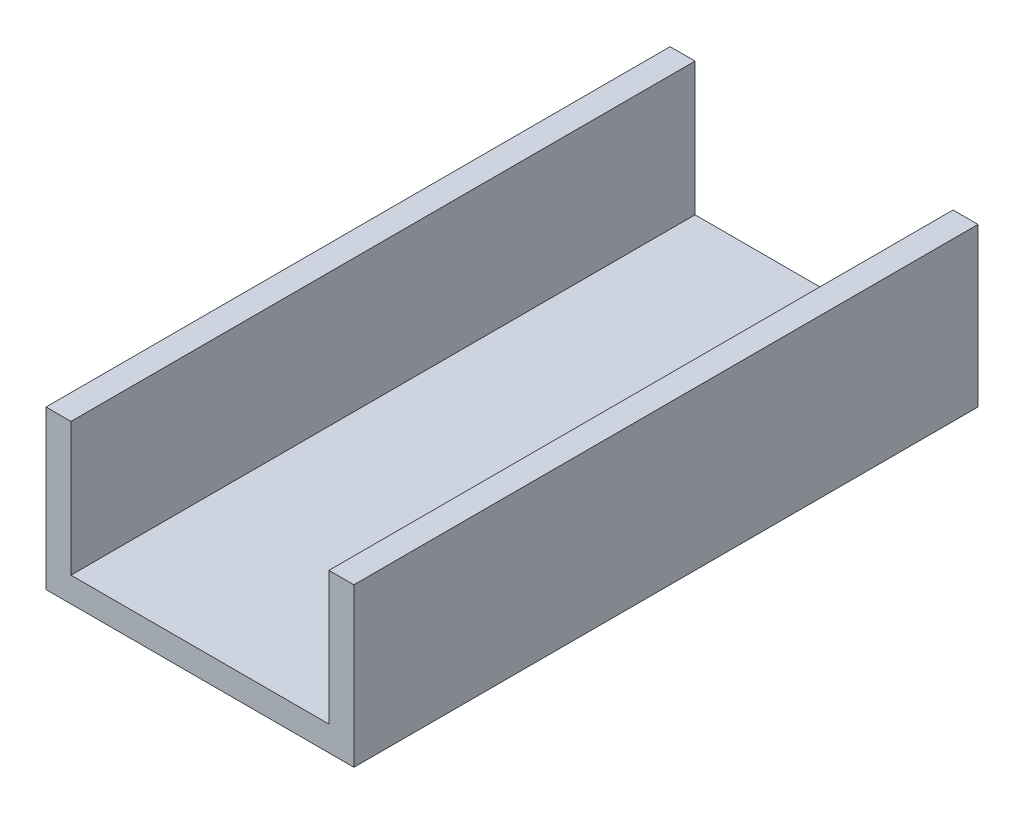
ISO-10303-21;
HEADER;
FILE_DESCRIPTION(('STEP AP214'),'2;1');
FILE_NAME('part.step','',(''),(''),'','','');
FILE_SCHEMA(('AUTOMOTIVE_DESIGN { 1 0 10303 214 1 1 1 1 }'));
ENDSEC;
DATA;
#1=APPLICATION_CONTEXT('core data for automotive mechanical design processes');
#2=APPLICATION_PROTOCOL_DEFINITION('international standard','automotive_design',2000,#1);
#3=PRODUCT_CONTEXT('',#1,'mechanical');
#4=PRODUCT('Part','Part','',(#3));
#5=PRODUCT_RELATED_PRODUCT_CATEGORY('part','',(#4));
#6=PRODUCT_DEFINITION_FORMATION('','',#4);
#7=PRODUCT_DEFINITION_CONTEXT('part definition',#1,'design');
#8=PRODUCT_DEFINITION('design','',#6,#7);
#9=PRODUCT_DEFINITION_SHAPE('','',#8);
#10=(LENGTH_UNIT() NAMED_UNIT(*) SI_UNIT(.MILLI.,.METRE.));
#11=(NAMED_UNIT(*) PLANE_ANGLE_UNIT() SI_UNIT($,.RADIAN.));
#12=(NAMED_UNIT(*) SI_UNIT($,.STERADIAN.) SOLID_ANGLE_UNIT());
#13=UNCERTAINTY_MEASURE_WITH_UNIT(LENGTH_MEASURE(1.E-05),#10,'distance_accuracy_value','');
#14=(GEOMETRIC_REPRESENTATION_CONTEXT(3) GLOBAL_UNCERTAINTY_ASSIGNED_CONTEXT((#13)) GLOBAL_UNIT_ASSIGNED_CONTEXT((#10,
#11,#12)) REPRESENTATION_CONTEXT('',''));
#15=CARTESIAN_POINT('',(0.,0.,0.));
#16=DIRECTION('',(0.,0.,1.));
#17=DIRECTION('',(1.,0.,0.));
#18=AXIS2_PLACEMENT_3D('',#15,#16,#17);
#19=CARTESIAN_POINT('',(-9.24999999999999,9.5,19.5));
#20=DIRECTION('',(0.,1.,0.));
#21=DIRECTION('',(0.,0.,1.));
#22=AXIS2_PLACEMENT_3D('',#19,#20,#21);
#23=PLANE('',#22);
#24=DIRECTION('',(-1.,0.,0.));
#25=VECTOR('',#24,1.);
#26=CARTESIAN_POINT('',(-9.24999999999999,9.5,18.));
#27=LINE('',#26,#25);
#28=CARTESIAN_POINT('',(9.25000000000001,9.5,18.));
#29=VERTEX_POINT('',#28);
#30=CARTESIAN_POINT('',(7.75,9.5,18.));
#31=VERTEX_POINT('',#30);
#32=EDGE_CURVE('E108',#29,#31,#27,.T.);
#33=ORIENTED_EDGE('',*,*,#32,.F.);
#34=DIRECTION('',(0.,0.,-1.));
#35=VECTOR('',#34,1.);
#36=CARTESIAN_POINT('',(9.25,9.5,-19.5));
#37=LINE('',#36,#35);
#38=CARTESIAN_POINT('',(9.25,9.5,-19.5));
#39=VERTEX_POINT('',#38);
#40=EDGE_CURVE('E115',#29,#39,#37,.T.);
#41=ORIENTED_EDGE('',*,*,#40,.T.);
#42=DIRECTION('',(-1.,0.,0.));
#43=VECTOR('',#42,1.);
#44=CARTESIAN_POINT('',(7.75,9.5,-19.5));
#45=LINE('',#44,#43);
#46=CARTESIAN_POINT('',(7.75,9.5,-19.5));
#47=VERTEX_POINT('',#46);
#48=EDGE_CURVE('E165',#39,#47,#45,.T.);
#49=ORIENTED_EDGE('',*,*,#48,.T.);
#50=DIRECTION('',(0.,0.,1.));
#51=VECTOR('',#50,1.);
#52=CARTESIAN_POINT('',(7.75,9.5,-19.5));
#53=LINE('',#52,#51);
#54=EDGE_CURVE('E161',#47,#31,#53,.T.);
#55=ORIENTED_EDGE('',*,*,#54,.T.);
#56=EDGE_LOOP('',(#33,#41,#49,#55));
#57=FACE_BOUND('',#56,.T.);
#58=ADVANCED_FACE('F34',(#57),#23,.T.);
#59=CARTESIAN_POINT('',(9.25,1.5,-19.5));
#60=DIRECTION('',(-1.,0.,0.));
#61=DIRECTION('',(0.,0.,1.));
#62=AXIS2_PLACEMENT_3D('',#59,#60,#61);
#63=PLANE('',#62);
#64=ORIENTED_EDGE('',*,*,#40,.F.);
#65=DIRECTION('',(0.,1.,0.));
#66=VECTOR('',#65,1.);
#67=CARTESIAN_POINT('',(9.25000000000001,0.,18.));
#68=LINE('',#67,#66);
#69=CARTESIAN_POINT('',(9.25000000000001,0.,18.));
#70=VERTEX_POINT('',#69);
#71=EDGE_CURVE('E100',#70,#29,#68,.T.);
#72=ORIENTED_EDGE('',*,*,#71,.F.);
#73=DIRECTION('',(0.,0.,-1.));
#74=VECTOR('',#73,1.);
#75=CARTESIAN_POINT('',(9.25,0.,-19.5));
#76=LINE('',#75,#74);
#77=CARTESIAN_POINT('',(9.25,0.,-19.5));
#78=VERTEX_POINT('',#77);
#79=EDGE_CURVE('E113',#70,#78,#76,.T.);
#80=ORIENTED_EDGE('',*,*,#79,.T.);
#81=DIRECTION('',(0.,-1.,0.));
#82=VECTOR('',#81,1.);
#83=CARTESIAN_POINT('',(9.25,1.5,-19.5));
#84=LINE('',#83,#82);
#85=EDGE_CURVE('E42',#39,#78,#84,.T.);
#86=ORIENTED_EDGE('',*,*,#85,.F.);
#87=EDGE_LOOP('',(#64,#72,#80,#86));
#88=FACE_BOUND('',#87,.T.);
#89=ADVANCED_FACE('F36',(#88),#63,.F.);
#90=CARTESIAN_POINT('',(-9.25,1.5,-19.5));
#91=DIRECTION('',(0.,0.,1.));
#92=DIRECTION('',(1.,0.,0.));
#93=AXIS2_PLACEMENT_3D('',#90,#91,#92);
#94=PLANE('',#93);
#95=DIRECTION('',(-1.,0.,0.));
#96=VECTOR('',#95,1.);
#97=CARTESIAN_POINT('',(-9.25,0.,-19.5));
#98=LINE('',#97,#96);
#99=CARTESIAN_POINT('',(-9.25,0.,-19.5));
#100=VERTEX_POINT('',#99);
#101=EDGE_CURVE('E118',#78,#100,#98,.T.);
#102=ORIENTED_EDGE('',*,*,#101,.T.);
#103=DIRECTION('',(0.,-1.,0.));
#104=VECTOR('',#103,1.);
#105=CARTESIAN_POINT('',(-9.25,1.5,-19.5));
#106=LINE('',#105,#104);
#107=CARTESIAN_POINT('',(-9.25,9.5,-19.5));
#108=VERTEX_POINT('',#107);
#109=EDGE_CURVE('E132',#108,#100,#106,.T.);
#110=ORIENTED_EDGE('',*,*,#109,.F.);
#111=DIRECTION('',(-1.,0.,0.));
#112=VECTOR('',#111,1.);
#113=CARTESIAN_POINT('',(-9.25,9.5,-19.5));
#114=LINE('',#113,#112);
#115=CARTESIAN_POINT('',(-7.75,9.5,-19.5));
#116=VERTEX_POINT('',#115);
#117=EDGE_CURVE('E170',#116,#108,#114,.T.);
#118=ORIENTED_EDGE('',*,*,#117,.F.);
#119=DIRECTION('',(0.,-1.,0.));
#120=VECTOR('',#119,1.);
#121=CARTESIAN_POINT('',(-7.75,9.5,-19.5));
#122=LINE('',#121,#120);
#123=CARTESIAN_POINT('',(-7.75,1.5,-19.5));
#124=VERTEX_POINT('',#123);
#125=EDGE_CURVE('E147',#116,#124,#122,.T.);
#126=ORIENTED_EDGE('',*,*,#125,.T.);
#127=DIRECTION('',(-1.,0.,0.));
#128=VECTOR('',#127,1.);
#129=CARTESIAN_POINT('',(-9.25,1.5,-19.5));
#130=LINE('',#129,#128);
#131=CARTESIAN_POINT('',(7.75,1.5,-19.5));
#132=VERTEX_POINT('',#131);
#133=EDGE_CURVE('E49',#132,#124,#130,.T.);
#134=ORIENTED_EDGE('',*,*,#133,.F.);
#135=DIRECTION('',(0.,-1.,0.));
#136=VECTOR('',#135,1.);
#137=CARTESIAN_POINT('',(7.75,9.5,-19.5));
#138=LINE('',#137,#136);
#139=EDGE_CURVE('E120',#47,#132,#138,.T.);
#140=ORIENTED_EDGE('',*,*,#139,.F.);
#141=ORIENTED_EDGE('',*,*,#48,.F.);
#142=ORIENTED_EDGE('',*,*,#85,.T.);
#143=EDGE_LOOP('',(#102,#110,#118,#126,#134,#140,#141,#142));
#144=FACE_BOUND('',#143,.T.);
#145=ADVANCED_FACE('F164',(#144),#94,.F.);
#146=CARTESIAN_POINT('',(-9.25,1.5,-19.5));
#147=DIRECTION('',(1.,0.,0.));
#148=DIRECTION('',(0.,0.,-1.));
#149=AXIS2_PLACEMENT_3D('',#146,#147,#148);
#150=PLANE('',#149);
#151=DIRECTION('',(0.,0.,1.));
#152=VECTOR('',#151,1.);
#153=CARTESIAN_POINT('',(-9.25,0.,-19.5));
#154=LINE('',#153,#152);
#155=CARTESIAN_POINT('',(-9.24999999999999,0.,18.));
#156=VERTEX_POINT('',#155);
#157=EDGE_CURVE('E122',#100,#156,#154,.T.);
#158=ORIENTED_EDGE('',*,*,#157,.T.);
#159=DIRECTION('',(0.,1.,0.));
#160=VECTOR('',#159,1.);
#161=CARTESIAN_POINT('',(-9.24999999999999,0.,18.));
#162=LINE('',#161,#160);
#163=CARTESIAN_POINT('',(-9.24999999999999,9.5,18.));
#164=VERTEX_POINT('',#163);
#165=EDGE_CURVE('E103',#156,#164,#162,.T.);
#166=ORIENTED_EDGE('',*,*,#165,.T.);
#167=DIRECTION('',(0.,0.,1.));
#168=VECTOR('',#167,1.);
#169=CARTESIAN_POINT('',(-9.25,9.5,-19.5));
#170=LINE('',#169,#168);
#171=EDGE_CURVE('E146',#108,#164,#170,.T.);
#172=ORIENTED_EDGE('',*,*,#171,.F.);
#173=ORIENTED_EDGE('',*,*,#109,.T.);
#174=EDGE_LOOP('',(#158,#166,#172,#173));
#175=FACE_BOUND('',#174,.T.);
#176=ADVANCED_FACE('F185',(#175),#150,.F.);
#177=CARTESIAN_POINT('',(9.25000000000001,1.5,19.5));
#178=DIRECTION('',(0.,1.,0.));
#179=DIRECTION('',(0.,0.,1.));
#180=AXIS2_PLACEMENT_3D('',#177,#178,#179);
#181=PLANE('',#180);
#182=DIRECTION('',(0.,0.,-1.));
#183=VECTOR('',#182,1.);
#184=CARTESIAN_POINT('',(-7.75,1.5,-19.5));
#185=LINE('',#184,#183);
#186=CARTESIAN_POINT('',(-7.74999999999999,1.5,18.));
#187=VERTEX_POINT('',#186);
#188=EDGE_CURVE('E143',#187,#124,#185,.T.);
#189=ORIENTED_EDGE('',*,*,#188,.F.);
#190=DIRECTION('',(-1.,0.,0.));
#191=VECTOR('',#190,1.);
#192=CARTESIAN_POINT('',(-7.74999999999999,1.5,18.));
#193=LINE('',#192,#191);
#194=CARTESIAN_POINT('',(7.75000000000001,1.5,18.));
#195=VERTEX_POINT('',#194);
#196=EDGE_CURVE('E138',#195,#187,#193,.T.);
#197=ORIENTED_EDGE('',*,*,#196,.F.);
#198=DIRECTION('',(0.,0.,1.));
#199=VECTOR('',#198,1.);
#200=CARTESIAN_POINT('',(7.75,1.5,-19.5));
#201=LINE('',#200,#199);
#202=EDGE_CURVE('E54',#132,#195,#201,.T.);
#203=ORIENTED_EDGE('',*,*,#202,.F.);
#204=ORIENTED_EDGE('',*,*,#133,.T.);
#205=EDGE_LOOP('',(#189,#197,#203,#204));
#206=FACE_BOUND('',#205,.T.);
#207=ADVANCED_FACE('F158',(#206),#181,.T.);
#208=CARTESIAN_POINT('',(9.25000000000001,0.,19.5));
#209=DIRECTION('',(0.,1.,0.));
#210=DIRECTION('',(0.,0.,1.));
#211=AXIS2_PLACEMENT_3D('',#208,#209,#210);
#212=PLANE('',#211);
#213=ORIENTED_EDGE('',*,*,#79,.F.);
#214=DIRECTION('',(-1.,0.,0.));
#215=VECTOR('',#214,1.);
#216=CARTESIAN_POINT('',(-9.24999999999999,0.,18.));
#217=LINE('',#216,#215);
#218=EDGE_CURVE('E97',#70,#156,#217,.T.);
#219=ORIENTED_EDGE('',*,*,#218,.T.);
#220=ORIENTED_EDGE('',*,*,#157,.F.);
#221=ORIENTED_EDGE('',*,*,#101,.F.);
#222=EDGE_LOOP('',(#213,#219,#220,#221));
#223=FACE_BOUND('',#222,.T.);
#224=ADVANCED_FACE('F117',(#223),#212,.F.);
#225=CARTESIAN_POINT('',(7.75,9.5,-19.5));
#226=DIRECTION('',(1.,0.,0.));
#227=DIRECTION('',(0.,0.,-1.));
#228=AXIS2_PLACEMENT_3D('',#225,#226,#227);
#229=PLANE('',#228);
#230=ORIENTED_EDGE('',*,*,#202,.T.);
#231=DIRECTION('',(0.,-1.,0.));
#232=VECTOR('',#231,1.);
#233=CARTESIAN_POINT('',(7.75000000000001,9.5,18.));
#234=LINE('',#233,#232);
#235=EDGE_CURVE('E125',#31,#195,#234,.T.);
#236=ORIENTED_EDGE('',*,*,#235,.F.);
#237=ORIENTED_EDGE('',*,*,#54,.F.);
#238=ORIENTED_EDGE('',*,*,#139,.T.);
#239=EDGE_LOOP('',(#230,#236,#237,#238));
#240=FACE_BOUND('',#239,.T.);
#241=ADVANCED_FACE('F159',(#240),#229,.F.);
#242=CARTESIAN_POINT('',(-7.75,9.5,-19.5));
#243=DIRECTION('',(-1.,0.,0.));
#244=DIRECTION('',(0.,0.,1.));
#245=AXIS2_PLACEMENT_3D('',#242,#243,#244);
#246=PLANE('',#245);
#247=ORIENTED_EDGE('',*,*,#188,.T.);
#248=ORIENTED_EDGE('',*,*,#125,.F.);
#249=DIRECTION('',(0.,0.,-1.));
#250=VECTOR('',#249,1.);
#251=CARTESIAN_POINT('',(-7.75,9.5,-19.5));
#252=LINE('',#251,#250);
#253=CARTESIAN_POINT('',(-7.74999999999999,9.5,18.));
#254=VERTEX_POINT('',#253);
#255=EDGE_CURVE('E173',#254,#116,#252,.T.);
#256=ORIENTED_EDGE('',*,*,#255,.F.);
#257=DIRECTION('',(0.,-1.,0.));
#258=VECTOR('',#257,1.);
#259=CARTESIAN_POINT('',(-7.74999999999999,9.5,18.));
#260=LINE('',#259,#258);
#261=EDGE_CURVE('E152',#254,#187,#260,.T.);
#262=ORIENTED_EDGE('',*,*,#261,.T.);
#263=EDGE_LOOP('',(#247,#248,#256,#262));
#264=FACE_BOUND('',#263,.T.);
#265=ADVANCED_FACE('F188',(#264),#246,.F.);
#266=DIRECTION('',(-1.,0.,0.));
#267=VECTOR('',#266,1.);
#268=CARTESIAN_POINT('',(-9.24999999999999,9.5,18.));
#269=LINE('',#268,#267);
#270=EDGE_CURVE('E11',#254,#164,#269,.T.);
#271=ORIENTED_EDGE('',*,*,#270,.F.);
#272=ORIENTED_EDGE('',*,*,#255,.T.);
#273=ORIENTED_EDGE('',*,*,#117,.T.);
#274=ORIENTED_EDGE('',*,*,#171,.T.);
#275=EDGE_LOOP('',(#271,#272,#273,#274));
#276=FACE_BOUND('',#275,.T.);
#277=ADVANCED_FACE('F187',(#276),#23,.T.);
#278=CARTESIAN_POINT('',(-9.24999999999999,0.,18.));
#279=DIRECTION('',(0.,0.,-1.));
#280=DIRECTION('',(-1.,0.,0.));
#281=AXIS2_PLACEMENT_3D('',#278,#279,#280);
#282=PLANE('',#281);
#283=ORIENTED_EDGE('',*,*,#196,.T.);
#284=ORIENTED_EDGE('',*,*,#261,.F.);
#285=ORIENTED_EDGE('',*,*,#270,.T.);
#286=ORIENTED_EDGE('',*,*,#165,.F.);
#287=ORIENTED_EDGE('',*,*,#218,.F.);
#288=ORIENTED_EDGE('',*,*,#71,.T.);
#289=ORIENTED_EDGE('',*,*,#32,.T.);
#290=ORIENTED_EDGE('',*,*,#235,.T.);
#291=EDGE_LOOP('',(#283,#284,#285,#286,#287,#288,#289,#290));
#292=FACE_BOUND('',#291,.T.);
#293=ADVANCED_FACE('F99',(#292),#282,.F.);
#294=CLOSED_SHELL('',(#58,#89,#145,#176,#207,#224,#241,#265,#277,#293));
#295=MANIFOLD_SOLID_BREP('B2',#294);
#296=ADVANCED_BREP_SHAPE_REPRESENTATION('',(#18,#295),#14);
#297=SHAPE_DEFINITION_REPRESENTATION(#9,#296);
ENDSEC;
END-ISO-10303-21;
